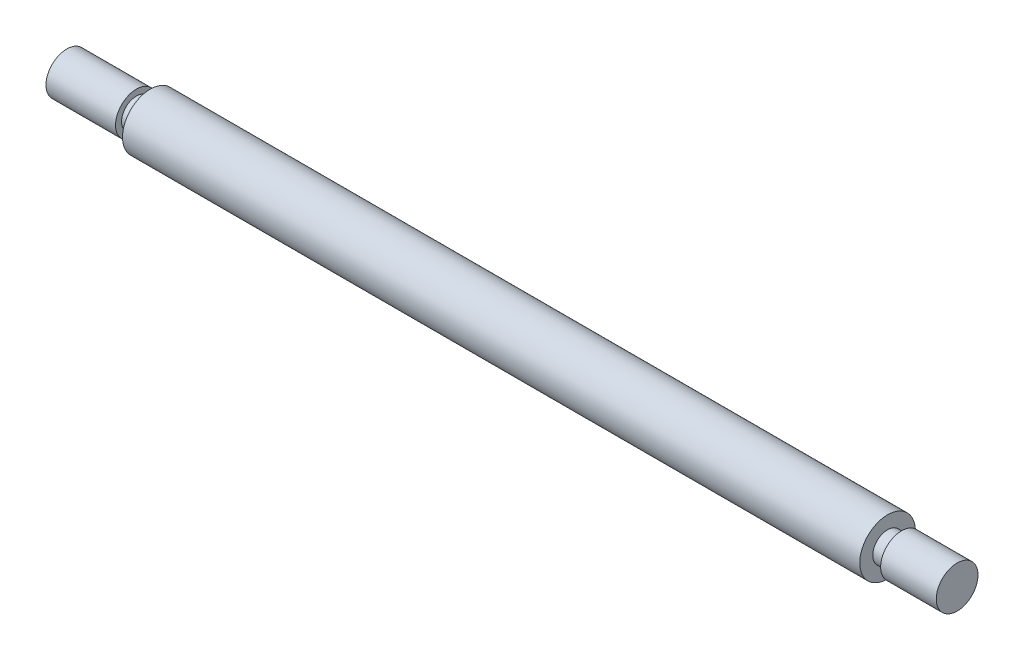
ISO-10303-21;
HEADER;
FILE_DESCRIPTION(('STEP AP214'),'2;1');
FILE_NAME('part.step','',(''),(''),'','','');
FILE_SCHEMA(('AUTOMOTIVE_DESIGN { 1 0 10303 214 1 1 1 1 }'));
ENDSEC;
DATA;
#1=APPLICATION_CONTEXT('core data for automotive mechanical design processes');
#2=APPLICATION_PROTOCOL_DEFINITION('international standard','automotive_design',2000,#1);
#3=PRODUCT_CONTEXT('',#1,'mechanical');
#4=PRODUCT('Part','Part','',(#3));
#5=PRODUCT_RELATED_PRODUCT_CATEGORY('part','',(#4));
#6=PRODUCT_DEFINITION_FORMATION('','',#4);
#7=PRODUCT_DEFINITION_CONTEXT('part definition',#1,'design');
#8=PRODUCT_DEFINITION('design','',#6,#7);
#9=PRODUCT_DEFINITION_SHAPE('','',#8);
#10=(LENGTH_UNIT() NAMED_UNIT(*) SI_UNIT(.MILLI.,.METRE.));
#11=(NAMED_UNIT(*) PLANE_ANGLE_UNIT() SI_UNIT($,.RADIAN.));
#12=(NAMED_UNIT(*) SI_UNIT($,.STERADIAN.) SOLID_ANGLE_UNIT());
#13=UNCERTAINTY_MEASURE_WITH_UNIT(LENGTH_MEASURE(1.E-05),#10,'distance_accuracy_value','');
#14=(GEOMETRIC_REPRESENTATION_CONTEXT(3) GLOBAL_UNCERTAINTY_ASSIGNED_CONTEXT((#13)) GLOBAL_UNIT_ASSIGNED_CONTEXT((#10,
#11,#12)) REPRESENTATION_CONTEXT('',''));
#15=CARTESIAN_POINT('',(0.,0.,0.));
#16=DIRECTION('',(0.,0.,1.));
#17=DIRECTION('',(1.,0.,0.));
#18=AXIS2_PLACEMENT_3D('',#15,#16,#17);
#19=CARTESIAN_POINT('',(0.,0.,0.));
#20=DIRECTION('',(-1.,0.,0.));
#21=DIRECTION('',(0.,0.,1.));
#22=AXIS2_PLACEMENT_3D('',#19,#20,#21);
#23=PLANE('',#22);
#24=CARTESIAN_POINT('',(0.,0.,0.));
#25=DIRECTION('',(1.,0.,0.));
#26=DIRECTION('',(0.,0.,-1.));
#27=AXIS2_PLACEMENT_3D('',#24,#25,#26);
#28=CIRCLE('',#27,0.187499999999999);
#29=CARTESIAN_POINT('',(0.,0.,-0.187499999999999));
#30=VERTEX_POINT('',#29);
#31=EDGE_CURVE('E10',#30,#30,#28,.T.);
#32=ORIENTED_EDGE('',*,*,#31,.F.);
#33=EDGE_LOOP('',(#32));
#34=FACE_BOUND('',#33,.T.);
#35=ADVANCED_FACE('F31',(#34),#23,.T.);
#36=CARTESIAN_POINT('',(8.,0.,0.));
#37=DIRECTION('',(1.,0.,0.));
#38=DIRECTION('',(0.,0.,-1.));
#39=AXIS2_PLACEMENT_3D('',#36,#37,#38);
#40=CYLINDRICAL_SURFACE('',#39,0.187499999999999);
#41=ORIENTED_EDGE('',*,*,#31,.T.);
#42=EDGE_LOOP('',(#41));
#43=FACE_BOUND('',#42,.T.);
#44=CARTESIAN_POINT('',(0.625,0.,0.));
#45=DIRECTION('',(1.,0.,0.));
#46=DIRECTION('',(0.,0.,-1.));
#47=AXIS2_PLACEMENT_3D('',#44,#45,#46);
#48=CIRCLE('',#47,0.187499999999999);
#49=CARTESIAN_POINT('',(0.625,0.,-0.187499999999999));
#50=VERTEX_POINT('',#49);
#51=EDGE_CURVE('E37',#50,#50,#48,.T.);
#52=ORIENTED_EDGE('',*,*,#51,.F.);
#53=EDGE_LOOP('',(#52));
#54=FACE_BOUND('',#53,.T.);
#55=ADVANCED_FACE('F85',(#43,#54),#40,.T.);
#56=CARTESIAN_POINT('',(0.625,0.187499999999999,0.));
#57=DIRECTION('',(1.,0.,0.));
#58=DIRECTION('',(0.,0.,-1.));
#59=AXIS2_PLACEMENT_3D('',#56,#57,#58);
#60=PLANE('',#59);
#61=ORIENTED_EDGE('',*,*,#51,.T.);
#62=EDGE_LOOP('',(#61));
#63=FACE_BOUND('',#62,.T.);
#64=CARTESIAN_POINT('',(0.625,0.,0.));
#65=DIRECTION('',(1.,0.,0.));
#66=DIRECTION('',(0.,0.,-1.));
#67=AXIS2_PLACEMENT_3D('',#64,#65,#66);
#68=CIRCLE('',#67,0.133399999999999);
#69=CARTESIAN_POINT('',(0.625,0.,-0.133399999999999));
#70=VERTEX_POINT('',#69);
#71=EDGE_CURVE('E41',#70,#70,#68,.T.);
#72=ORIENTED_EDGE('',*,*,#71,.F.);
#73=EDGE_LOOP('',(#72));
#74=FACE_BOUND('',#73,.T.);
#75=ADVANCED_FACE('F90',(#63,#74),#60,.T.);
#76=CARTESIAN_POINT('',(8.,0.,0.));
#77=DIRECTION('',(1.,0.,0.));
#78=DIRECTION('',(0.,0.,-1.));
#79=AXIS2_PLACEMENT_3D('',#76,#77,#78);
#80=CYLINDRICAL_SURFACE('',#79,0.133399999999999);
#81=ORIENTED_EDGE('',*,*,#71,.T.);
#82=EDGE_LOOP('',(#81));
#83=FACE_BOUND('',#82,.T.);
#84=CARTESIAN_POINT('',(0.75,0.,0.));
#85=DIRECTION('',(1.,0.,0.));
#86=DIRECTION('',(0.,0.,-1.));
#87=AXIS2_PLACEMENT_3D('',#84,#85,#86);
#88=CIRCLE('',#87,0.133399999999999);
#89=CARTESIAN_POINT('',(0.75,0.,-0.133399999999999));
#90=VERTEX_POINT('',#89);
#91=EDGE_CURVE('E45',#90,#90,#88,.T.);
#92=ORIENTED_EDGE('',*,*,#91,.F.);
#93=EDGE_LOOP('',(#92));
#94=FACE_BOUND('',#93,.T.);
#95=ADVANCED_FACE('F94',(#83,#94),#80,.T.);
#96=CARTESIAN_POINT('',(0.75,0.133399999999999,0.));
#97=DIRECTION('',(-1.,0.,0.));
#98=DIRECTION('',(0.,0.,1.));
#99=AXIS2_PLACEMENT_3D('',#96,#97,#98);
#100=PLANE('',#99);
#101=ORIENTED_EDGE('',*,*,#91,.T.);
#102=EDGE_LOOP('',(#101));
#103=FACE_BOUND('',#102,.T.);
#104=CARTESIAN_POINT('',(0.75,0.,0.));
#105=DIRECTION('',(1.,0.,0.));
#106=DIRECTION('',(0.,0.,-1.));
#107=AXIS2_PLACEMENT_3D('',#104,#105,#106);
#108=CIRCLE('',#107,0.249999999999999);
#109=CARTESIAN_POINT('',(0.75,0.,-0.249999999999999));
#110=VERTEX_POINT('',#109);
#111=EDGE_CURVE('E50',#110,#110,#108,.T.);
#112=ORIENTED_EDGE('',*,*,#111,.F.);
#113=EDGE_LOOP('',(#112));
#114=FACE_BOUND('',#113,.T.);
#115=ADVANCED_FACE('F100',(#103,#114),#100,.T.);
#116=CARTESIAN_POINT('',(8.,0.,0.));
#117=DIRECTION('',(1.,0.,0.));
#118=DIRECTION('',(0.,0.,-1.));
#119=AXIS2_PLACEMENT_3D('',#116,#117,#118);
#120=CYLINDRICAL_SURFACE('',#119,0.249999999999999);
#121=ORIENTED_EDGE('',*,*,#111,.T.);
#122=EDGE_LOOP('',(#121));
#123=FACE_BOUND('',#122,.T.);
#124=CARTESIAN_POINT('',(7.375,0.,0.));
#125=DIRECTION('',(1.,0.,0.));
#126=DIRECTION('',(0.,0.,-1.));
#127=AXIS2_PLACEMENT_3D('',#124,#125,#126);
#128=CIRCLE('',#127,0.249999999999999);
#129=CARTESIAN_POINT('',(7.375,0.,-0.249999999999999));
#130=VERTEX_POINT('',#129);
#131=EDGE_CURVE('E53',#130,#130,#128,.T.);
#132=ORIENTED_EDGE('',*,*,#131,.F.);
#133=EDGE_LOOP('',(#132));
#134=FACE_BOUND('',#133,.T.);
#135=ADVANCED_FACE('F104',(#123,#134),#120,.T.);
#136=CARTESIAN_POINT('',(7.375,0.249999999999999,0.));
#137=DIRECTION('',(1.,0.,0.));
#138=DIRECTION('',(0.,0.,-1.));
#139=AXIS2_PLACEMENT_3D('',#136,#137,#138);
#140=PLANE('',#139);
#141=ORIENTED_EDGE('',*,*,#131,.T.);
#142=EDGE_LOOP('',(#141));
#143=FACE_BOUND('',#142,.T.);
#144=CARTESIAN_POINT('',(7.375,0.,0.));
#145=DIRECTION('',(1.,0.,0.));
#146=DIRECTION('',(0.,0.,-1.));
#147=AXIS2_PLACEMENT_3D('',#144,#145,#146);
#148=CIRCLE('',#147,0.133399999999999);
#149=CARTESIAN_POINT('',(7.375,0.,-0.133399999999999));
#150=VERTEX_POINT('',#149);
#151=EDGE_CURVE('E56',#150,#150,#148,.T.);
#152=ORIENTED_EDGE('',*,*,#151,.F.);
#153=EDGE_LOOP('',(#152));
#154=FACE_BOUND('',#153,.T.);
#155=ADVANCED_FACE('F108',(#143,#154),#140,.T.);
#156=CARTESIAN_POINT('',(8.,0.,0.));
#157=DIRECTION('',(1.,0.,0.));
#158=DIRECTION('',(0.,0.,-1.));
#159=AXIS2_PLACEMENT_3D('',#156,#157,#158);
#160=CYLINDRICAL_SURFACE('',#159,0.133399999999999);
#161=ORIENTED_EDGE('',*,*,#151,.T.);
#162=EDGE_LOOP('',(#161));
#163=FACE_BOUND('',#162,.T.);
#164=CARTESIAN_POINT('',(7.5,0.,0.));
#165=DIRECTION('',(1.,0.,0.));
#166=DIRECTION('',(0.,0.,-1.));
#167=AXIS2_PLACEMENT_3D('',#164,#165,#166);
#168=CIRCLE('',#167,0.133399999999999);
#169=CARTESIAN_POINT('',(7.5,0.,-0.133399999999999));
#170=VERTEX_POINT('',#169);
#171=EDGE_CURVE('E59',#170,#170,#168,.T.);
#172=ORIENTED_EDGE('',*,*,#171,.F.);
#173=EDGE_LOOP('',(#172));
#174=FACE_BOUND('',#173,.T.);
#175=ADVANCED_FACE('F81',(#163,#174),#160,.T.);
#176=CARTESIAN_POINT('',(7.5,0.133399999999999,0.));
#177=DIRECTION('',(-1.,0.,0.));
#178=DIRECTION('',(0.,0.,1.));
#179=AXIS2_PLACEMENT_3D('',#176,#177,#178);
#180=PLANE('',#179);
#181=ORIENTED_EDGE('',*,*,#171,.T.);
#182=EDGE_LOOP('',(#181));
#183=FACE_BOUND('',#182,.T.);
#184=CARTESIAN_POINT('',(7.5,0.,0.));
#185=DIRECTION('',(1.,0.,0.));
#186=DIRECTION('',(0.,0.,-1.));
#187=AXIS2_PLACEMENT_3D('',#184,#185,#186);
#188=CIRCLE('',#187,0.1875);
#189=CARTESIAN_POINT('',(7.5,0.,-0.1875));
#190=VERTEX_POINT('',#189);
#191=EDGE_CURVE('E62',#190,#190,#188,.T.);
#192=ORIENTED_EDGE('',*,*,#191,.F.);
#193=EDGE_LOOP('',(#192));
#194=FACE_BOUND('',#193,.T.);
#195=ADVANCED_FACE('F73',(#183,#194),#180,.T.);
#196=CARTESIAN_POINT('',(8.,0.,0.));
#197=DIRECTION('',(1.,0.,0.));
#198=DIRECTION('',(0.,0.,-1.));
#199=AXIS2_PLACEMENT_3D('',#196,#197,#198);
#200=CYLINDRICAL_SURFACE('',#199,0.1875);
#201=ORIENTED_EDGE('',*,*,#191,.T.);
#202=EDGE_LOOP('',(#201));
#203=FACE_BOUND('',#202,.T.);
#204=CARTESIAN_POINT('',(8.,0.,0.));
#205=DIRECTION('',(1.,0.,0.));
#206=DIRECTION('',(0.,0.,-1.));
#207=AXIS2_PLACEMENT_3D('',#204,#205,#206);
#208=CIRCLE('',#207,0.1875);
#209=CARTESIAN_POINT('',(8.,0.,-0.1875));
#210=VERTEX_POINT('',#209);
#211=EDGE_CURVE('E65',#210,#210,#208,.T.);
#212=ORIENTED_EDGE('',*,*,#211,.F.);
#213=EDGE_LOOP('',(#212));
#214=FACE_BOUND('',#213,.T.);
#215=ADVANCED_FACE('F71',(#203,#214),#200,.T.);
#216=CARTESIAN_POINT('',(8.,0.1875,0.));
#217=DIRECTION('',(1.,0.,0.));
#218=DIRECTION('',(0.,0.,-1.));
#219=AXIS2_PLACEMENT_3D('',#216,#217,#218);
#220=PLANE('',#219);
#221=ORIENTED_EDGE('',*,*,#211,.T.);
#222=EDGE_LOOP('',(#221));
#223=FACE_BOUND('',#222,.T.);
#224=ADVANCED_FACE('F69',(#223),#220,.T.);
#225=CLOSED_SHELL('',(#35,#55,#75,#95,#115,#135,#155,#175,#195,#215,#224));
#226=MANIFOLD_SOLID_BREP('B2',#225);
#227=ADVANCED_BREP_SHAPE_REPRESENTATION('',(#18,#226),#14);
#228=SHAPE_DEFINITION_REPRESENTATION(#9,#227);
ENDSEC;
END-ISO-10303-21;
